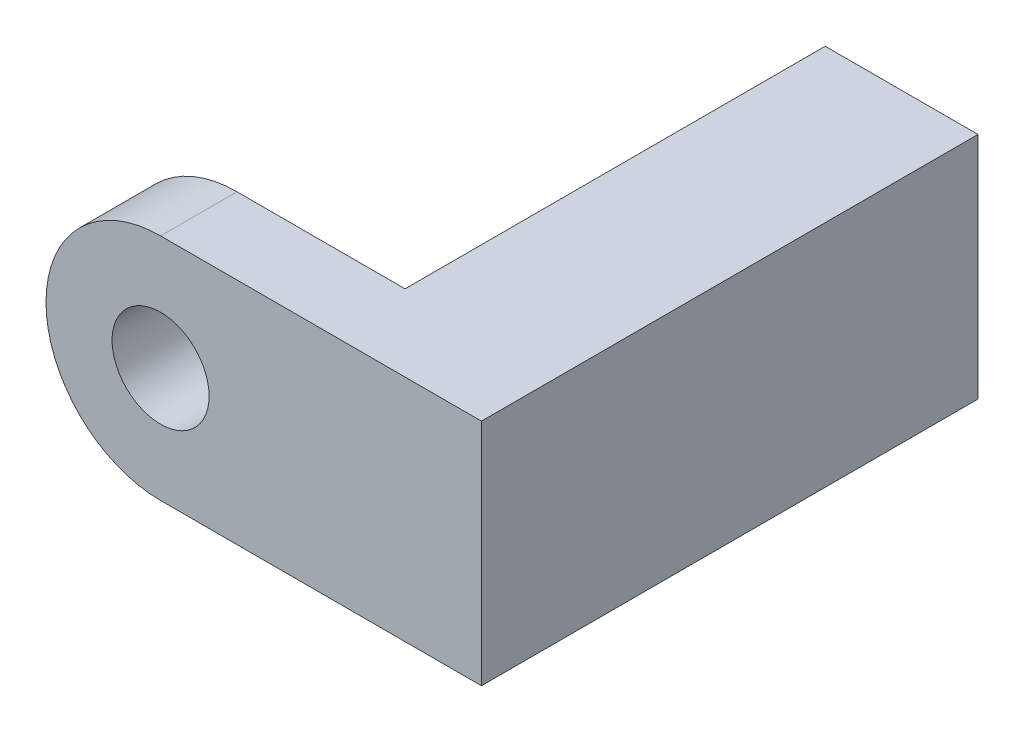
ISO-10303-21;
HEADER;
FILE_DESCRIPTION(('STEP AP214'),'2;1');
FILE_NAME('part.step','',(''),(''),'','','');
FILE_SCHEMA(('AUTOMOTIVE_DESIGN { 1 0 10303 214 1 1 1 1 }'));
ENDSEC;
DATA;
#1=APPLICATION_CONTEXT('core data for automotive mechanical design processes');
#2=APPLICATION_PROTOCOL_DEFINITION('international standard','automotive_design',2000,#1);
#3=PRODUCT_CONTEXT('',#1,'mechanical');
#4=PRODUCT('Part','Part','',(#3));
#5=PRODUCT_RELATED_PRODUCT_CATEGORY('part','',(#4));
#6=PRODUCT_DEFINITION_FORMATION('','',#4);
#7=PRODUCT_DEFINITION_CONTEXT('part definition',#1,'design');
#8=PRODUCT_DEFINITION('design','',#6,#7);
#9=PRODUCT_DEFINITION_SHAPE('','',#8);
#10=(LENGTH_UNIT() NAMED_UNIT(*) SI_UNIT(.MILLI.,.METRE.));
#11=(NAMED_UNIT(*) PLANE_ANGLE_UNIT() SI_UNIT($,.RADIAN.));
#12=(NAMED_UNIT(*) SI_UNIT($,.STERADIAN.) SOLID_ANGLE_UNIT());
#13=UNCERTAINTY_MEASURE_WITH_UNIT(LENGTH_MEASURE(1.E-05),#10,'distance_accuracy_value','');
#14=(GEOMETRIC_REPRESENTATION_CONTEXT(3) GLOBAL_UNCERTAINTY_ASSIGNED_CONTEXT((#13)) GLOBAL_UNIT_ASSIGNED_CONTEXT((#10,
#11,#12)) REPRESENTATION_CONTEXT('',''));
#15=CARTESIAN_POINT('',(0.,0.,0.));
#16=DIRECTION('',(0.,0.,1.));
#17=DIRECTION('',(1.,0.,0.));
#18=AXIS2_PLACEMENT_3D('',#15,#16,#17);
#19=CARTESIAN_POINT('',(22.,15.,55.));
#20=DIRECTION('',(1.,0.,0.));
#21=DIRECTION('',(0.,0.,-1.));
#22=AXIS2_PLACEMENT_3D('',#19,#20,#21);
#23=PLANE('',#22);
#24=DIRECTION('',(0.,-1.,0.));
#25=VECTOR('',#24,1.);
#26=CARTESIAN_POINT('',(22.,15.,0.));
#27=LINE('',#26,#25);
#28=CARTESIAN_POINT('',(22.,15.,0.));
#29=VERTEX_POINT('',#28);
#30=CARTESIAN_POINT('',(22.,-15.,0.));
#31=VERTEX_POINT('',#30);
#32=EDGE_CURVE('E96',#29,#31,#27,.T.);
#33=ORIENTED_EDGE('',*,*,#32,.T.);
#34=DIRECTION('',(0.,0.,-1.));
#35=VECTOR('',#34,1.);
#36=CARTESIAN_POINT('',(22.,-15.,55.));
#37=LINE('',#36,#35);
#38=CARTESIAN_POINT('',(22.,-15.,55.));
#39=VERTEX_POINT('',#38);
#40=EDGE_CURVE('E11',#39,#31,#37,.T.);
#41=ORIENTED_EDGE('',*,*,#40,.F.);
#42=DIRECTION('',(0.,-1.,0.));
#43=VECTOR('',#42,1.);
#44=CARTESIAN_POINT('',(22.,15.,55.));
#45=LINE('',#44,#43);
#46=CARTESIAN_POINT('',(22.,15.,55.));
#47=VERTEX_POINT('',#46);
#48=EDGE_CURVE('E98',#47,#39,#45,.T.);
#49=ORIENTED_EDGE('',*,*,#48,.F.);
#50=DIRECTION('',(0.,0.,-1.));
#51=VECTOR('',#50,1.);
#52=CARTESIAN_POINT('',(22.,15.,55.));
#53=LINE('',#52,#51);
#54=EDGE_CURVE('E55',#47,#29,#53,.T.);
#55=ORIENTED_EDGE('',*,*,#54,.T.);
#56=EDGE_LOOP('',(#33,#41,#49,#55));
#57=FACE_BOUND('',#56,.T.);
#58=ADVANCED_FACE('F39',(#57),#23,.F.);
#59=CARTESIAN_POINT('',(22.,-15.,55.));
#60=DIRECTION('',(0.,1.,0.));
#61=DIRECTION('',(0.,0.,1.));
#62=AXIS2_PLACEMENT_3D('',#59,#60,#61);
#63=PLANE('',#62);
#64=DIRECTION('',(1.,0.,0.));
#65=VECTOR('',#64,1.);
#66=CARTESIAN_POINT('',(22.,-15.,0.));
#67=LINE('',#66,#65);
#68=CARTESIAN_POINT('',(42.,-15.,0.));
#69=VERTEX_POINT('',#68);
#70=EDGE_CURVE('E84',#31,#69,#67,.T.);
#71=ORIENTED_EDGE('',*,*,#70,.T.);
#72=DIRECTION('',(0.,0.,-1.));
#73=VECTOR('',#72,1.);
#74=CARTESIAN_POINT('',(42.,-15.,55.));
#75=LINE('',#74,#73);
#76=CARTESIAN_POINT('',(42.,-15.,65.));
#77=VERTEX_POINT('',#76);
#78=EDGE_CURVE('E48',#77,#69,#75,.T.);
#79=ORIENTED_EDGE('',*,*,#78,.F.);
#80=DIRECTION('',(1.,0.,0.));
#81=VECTOR('',#80,1.);
#82=CARTESIAN_POINT('',(0.,-15.,65.));
#83=LINE('',#82,#81);
#84=CARTESIAN_POINT('',(0.,-15.,65.));
#85=VERTEX_POINT('',#84);
#86=EDGE_CURVE('E127',#85,#77,#83,.T.);
#87=ORIENTED_EDGE('',*,*,#86,.F.);
#88=DIRECTION('',(0.,0.,-1.));
#89=VECTOR('',#88,1.);
#90=CARTESIAN_POINT('',(0.,-15.,65.));
#91=LINE('',#90,#89);
#92=CARTESIAN_POINT('',(0.,-15.,55.));
#93=VERTEX_POINT('',#92);
#94=EDGE_CURVE('E135',#85,#93,#91,.T.);
#95=ORIENTED_EDGE('',*,*,#94,.T.);
#96=DIRECTION('',(1.,0.,0.));
#97=VECTOR('',#96,1.);
#98=CARTESIAN_POINT('',(0.,-15.,55.));
#99=LINE('',#98,#97);
#100=EDGE_CURVE('E122',#93,#39,#99,.T.);
#101=ORIENTED_EDGE('',*,*,#100,.T.);
#102=ORIENTED_EDGE('',*,*,#40,.T.);
#103=EDGE_LOOP('',(#71,#79,#87,#95,#101,#102));
#104=FACE_BOUND('',#103,.T.);
#105=ADVANCED_FACE('F142',(#104),#63,.F.);
#106=CARTESIAN_POINT('',(42.,15.,55.));
#107=DIRECTION('',(-1.,0.,0.));
#108=DIRECTION('',(0.,0.,1.));
#109=AXIS2_PLACEMENT_3D('',#106,#107,#108);
#110=PLANE('',#109);
#111=DIRECTION('',(0.,1.,0.));
#112=VECTOR('',#111,1.);
#113=CARTESIAN_POINT('',(42.,15.,0.));
#114=LINE('',#113,#112);
#115=CARTESIAN_POINT('',(42.,15.,0.));
#116=VERTEX_POINT('',#115);
#117=EDGE_CURVE('E72',#69,#116,#114,.T.);
#118=ORIENTED_EDGE('',*,*,#117,.T.);
#119=DIRECTION('',(0.,0.,-1.));
#120=VECTOR('',#119,1.);
#121=CARTESIAN_POINT('',(42.,15.,55.));
#122=LINE('',#121,#120);
#123=CARTESIAN_POINT('',(42.,15.,65.));
#124=VERTEX_POINT('',#123);
#125=EDGE_CURVE('E77',#124,#116,#122,.T.);
#126=ORIENTED_EDGE('',*,*,#125,.F.);
#127=DIRECTION('',(0.,1.,0.));
#128=VECTOR('',#127,1.);
#129=CARTESIAN_POINT('',(42.,15.,65.));
#130=LINE('',#129,#128);
#131=EDGE_CURVE('E157',#77,#124,#130,.T.);
#132=ORIENTED_EDGE('',*,*,#131,.F.);
#133=ORIENTED_EDGE('',*,*,#78,.T.);
#134=EDGE_LOOP('',(#118,#126,#132,#133));
#135=FACE_BOUND('',#134,.T.);
#136=ADVANCED_FACE('F74',(#135),#110,.F.);
#137=CARTESIAN_POINT('',(22.,15.,55.));
#138=DIRECTION('',(0.,-1.,0.));
#139=DIRECTION('',(0.,0.,-1.));
#140=AXIS2_PLACEMENT_3D('',#137,#138,#139);
#141=PLANE('',#140);
#142=DIRECTION('',(-1.,0.,0.));
#143=VECTOR('',#142,1.);
#144=CARTESIAN_POINT('',(22.,15.,0.));
#145=LINE('',#144,#143);
#146=EDGE_CURVE('E83',#116,#29,#145,.T.);
#147=ORIENTED_EDGE('',*,*,#146,.T.);
#148=ORIENTED_EDGE('',*,*,#54,.F.);
#149=DIRECTION('',(-1.,0.,0.));
#150=VECTOR('',#149,1.);
#151=CARTESIAN_POINT('',(42.,15.,55.));
#152=LINE('',#151,#150);
#153=CARTESIAN_POINT('',(0.,15.,55.));
#154=VERTEX_POINT('',#153);
#155=EDGE_CURVE('E114',#47,#154,#152,.T.);
#156=ORIENTED_EDGE('',*,*,#155,.T.);
#157=DIRECTION('',(0.,0.,-1.));
#158=VECTOR('',#157,1.);
#159=CARTESIAN_POINT('',(0.,15.,65.));
#160=LINE('',#159,#158);
#161=CARTESIAN_POINT('',(0.,15.,65.));
#162=VERTEX_POINT('',#161);
#163=EDGE_CURVE('E132',#162,#154,#160,.T.);
#164=ORIENTED_EDGE('',*,*,#163,.F.);
#165=DIRECTION('',(-1.,0.,0.));
#166=VECTOR('',#165,1.);
#167=CARTESIAN_POINT('',(42.,15.,65.));
#168=LINE('',#167,#166);
#169=EDGE_CURVE('E90',#124,#162,#168,.T.);
#170=ORIENTED_EDGE('',*,*,#169,.F.);
#171=ORIENTED_EDGE('',*,*,#125,.T.);
#172=EDGE_LOOP('',(#147,#148,#156,#164,#170,#171));
#173=FACE_BOUND('',#172,.T.);
#174=ADVANCED_FACE('F87',(#173),#141,.F.);
#175=CARTESIAN_POINT('',(0.,0.,0.));
#176=DIRECTION('',(0.,0.,1.));
#177=DIRECTION('',(1.,0.,0.));
#178=AXIS2_PLACEMENT_3D('',#175,#176,#177);
#179=PLANE('',#178);
#180=ORIENTED_EDGE('',*,*,#32,.F.);
#181=ORIENTED_EDGE('',*,*,#146,.F.);
#182=ORIENTED_EDGE('',*,*,#117,.F.);
#183=ORIENTED_EDGE('',*,*,#70,.F.);
#184=EDGE_LOOP('',(#180,#181,#182,#183));
#185=FACE_BOUND('',#184,.T.);
#186=ADVANCED_FACE('F94',(#185),#179,.F.);
#187=CARTESIAN_POINT('',(0.,0.,55.));
#188=DIRECTION('',(0.,0.,1.));
#189=DIRECTION('',(1.,0.,0.));
#190=AXIS2_PLACEMENT_3D('',#187,#188,#189);
#191=PLANE('',#190);
#192=CARTESIAN_POINT('',(0.,0.,55.));
#193=DIRECTION('',(0.,0.,1.));
#194=DIRECTION('',(1.,0.,0.));
#195=AXIS2_PLACEMENT_3D('',#192,#193,#194);
#196=CIRCLE('',#195,6.35);
#197=CARTESIAN_POINT('',(6.35,0.,55.));
#198=VERTEX_POINT('',#197);
#199=EDGE_CURVE('E164',#198,#198,#196,.F.);
#200=ORIENTED_EDGE('',*,*,#199,.F.);
#201=EDGE_LOOP('',(#200));
#202=FACE_BOUND('',#201,.T.);
#203=ORIENTED_EDGE('',*,*,#155,.F.);
#204=ORIENTED_EDGE('',*,*,#48,.T.);
#205=ORIENTED_EDGE('',*,*,#100,.F.);
#206=CARTESIAN_POINT('',(0.,0.,55.));
#207=DIRECTION('',(0.,0.,1.));
#208=DIRECTION('',(1.,0.,0.));
#209=AXIS2_PLACEMENT_3D('',#206,#207,#208);
#210=CIRCLE('',#209,15.);
#211=EDGE_CURVE('E118',#154,#93,#210,.T.);
#212=ORIENTED_EDGE('',*,*,#211,.F.);
#213=EDGE_LOOP('',(#203,#204,#205,#212));
#214=FACE_BOUND('',#213,.T.);
#215=ADVANCED_FACE('F115',(#202,#214),#191,.F.);
#216=CARTESIAN_POINT('',(0.,0.,65.));
#217=DIRECTION('',(0.,0.,-1.));
#218=DIRECTION('',(-1.,0.,0.));
#219=AXIS2_PLACEMENT_3D('',#216,#217,#218);
#220=CYLINDRICAL_SURFACE('',#219,15.);
#221=ORIENTED_EDGE('',*,*,#211,.T.);
#222=ORIENTED_EDGE('',*,*,#94,.F.);
#223=CARTESIAN_POINT('',(0.,0.,65.));
#224=DIRECTION('',(0.,0.,1.));
#225=DIRECTION('',(1.,0.,0.));
#226=AXIS2_PLACEMENT_3D('',#223,#224,#225);
#227=CIRCLE('',#226,15.);
#228=EDGE_CURVE('E121',#162,#85,#227,.T.);
#229=ORIENTED_EDGE('',*,*,#228,.F.);
#230=ORIENTED_EDGE('',*,*,#163,.T.);
#231=EDGE_LOOP('',(#221,#222,#229,#230));
#232=FACE_BOUND('',#231,.T.);
#233=ADVANCED_FACE('F162',(#232),#220,.T.);
#234=CARTESIAN_POINT('',(0.,0.,65.));
#235=DIRECTION('',(0.,0.,1.));
#236=DIRECTION('',(1.,0.,0.));
#237=AXIS2_PLACEMENT_3D('',#234,#235,#236);
#238=PLANE('',#237);
#239=CARTESIAN_POINT('',(0.,0.,65.));
#240=DIRECTION('',(0.,0.,1.));
#241=DIRECTION('',(1.,0.,0.));
#242=AXIS2_PLACEMENT_3D('',#239,#240,#241);
#243=CIRCLE('',#242,6.35);
#244=CARTESIAN_POINT('',(6.35,0.,65.));
#245=VERTEX_POINT('',#244);
#246=EDGE_CURVE('E167',#245,#245,#243,.T.);
#247=ORIENTED_EDGE('',*,*,#246,.F.);
#248=EDGE_LOOP('',(#247));
#249=FACE_BOUND('',#248,.T.);
#250=ORIENTED_EDGE('',*,*,#228,.T.);
#251=ORIENTED_EDGE('',*,*,#86,.T.);
#252=ORIENTED_EDGE('',*,*,#131,.T.);
#253=ORIENTED_EDGE('',*,*,#169,.T.);
#254=EDGE_LOOP('',(#250,#251,#252,#253));
#255=FACE_BOUND('',#254,.T.);
#256=ADVANCED_FACE('F160',(#249,#255),#238,.T.);
#257=CARTESIAN_POINT('',(0.,0.,37.0394877578617));
#258=DIRECTION('',(0.,0.,1.));
#259=DIRECTION('',(1.,0.,0.));
#260=AXIS2_PLACEMENT_3D('',#257,#258,#259);
#261=CYLINDRICAL_SURFACE('',#260,6.35);
#262=ORIENTED_EDGE('',*,*,#199,.T.);
#263=EDGE_LOOP('',(#262));
#264=FACE_BOUND('',#263,.T.);
#265=ORIENTED_EDGE('',*,*,#246,.T.);
#266=EDGE_LOOP('',(#265));
#267=FACE_BOUND('',#266,.T.);
#268=ADVANCED_FACE('F178',(#264,#267),#261,.F.);
#269=CLOSED_SHELL('',(#58,#105,#136,#174,#186,#215,#233,#256,#268));
#270=MANIFOLD_SOLID_BREP('B2',#269);
#271=ADVANCED_BREP_SHAPE_REPRESENTATION('',(#18,#270),#14);
#272=SHAPE_DEFINITION_REPRESENTATION(#9,#271);
ENDSEC;
END-ISO-10303-21;
